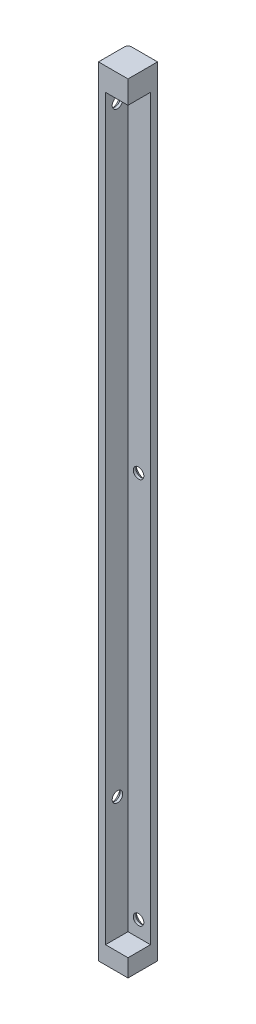
ISO-10303-21;
HEADER;
FILE_DESCRIPTION(('STEP AP214'),'2;1');
FILE_NAME('part.step','',(''),(''),'','','');
FILE_SCHEMA(('AUTOMOTIVE_DESIGN { 1 0 10303 214 1 1 1 1 }'));
ENDSEC;
DATA;
#1=APPLICATION_CONTEXT('core data for automotive mechanical design processes');
#2=APPLICATION_PROTOCOL_DEFINITION('international standard','automotive_design',2000,#1);
#3=PRODUCT_CONTEXT('',#1,'mechanical');
#4=PRODUCT('Part','Part','',(#3));
#5=PRODUCT_RELATED_PRODUCT_CATEGORY('part','',(#4));
#6=PRODUCT_DEFINITION_FORMATION('','',#4);
#7=PRODUCT_DEFINITION_CONTEXT('part definition',#1,'design');
#8=PRODUCT_DEFINITION('design','',#6,#7);
#9=PRODUCT_DEFINITION_SHAPE('','',#8);
#10=(LENGTH_UNIT() NAMED_UNIT(*) SI_UNIT(.MILLI.,.METRE.));
#11=(NAMED_UNIT(*) PLANE_ANGLE_UNIT() SI_UNIT($,.RADIAN.));
#12=(NAMED_UNIT(*) SI_UNIT($,.STERADIAN.) SOLID_ANGLE_UNIT());
#13=UNCERTAINTY_MEASURE_WITH_UNIT(LENGTH_MEASURE(1.E-05),#10,'distance_accuracy_value','');
#14=(GEOMETRIC_REPRESENTATION_CONTEXT(3) GLOBAL_UNCERTAINTY_ASSIGNED_CONTEXT((#13)) GLOBAL_UNIT_ASSIGNED_CONTEXT((#10,
#11,#12)) REPRESENTATION_CONTEXT('',''));
#15=CARTESIAN_POINT('',(0.,0.,0.));
#16=DIRECTION('',(0.,0.,1.));
#17=DIRECTION('',(1.,0.,0.));
#18=AXIS2_PLACEMENT_3D('',#15,#16,#17);
#19=CARTESIAN_POINT('',(2.,221.5,0.));
#20=DIRECTION('',(-1.,0.,0.));
#21=DIRECTION('',(0.,0.,1.));
#22=AXIS2_PLACEMENT_3D('',#19,#20,#21);
#23=PLANE('',#22);
#24=CARTESIAN_POINT('',(2.,211.249999999999,-4.));
#25=DIRECTION('',(-1.,0.,0.));
#26=DIRECTION('',(0.,0.,1.));
#27=AXIS2_PLACEMENT_3D('',#24,#25,#26);
#28=CIRCLE('',#27,1.5);
#29=CARTESIAN_POINT('',(2.,211.249999999999,-2.5));
#30=VERTEX_POINT('',#29);
#31=EDGE_CURVE('E188',#30,#30,#28,.T.);
#32=ORIENTED_EDGE('',*,*,#31,.T.);
#33=EDGE_LOOP('',(#32));
#34=FACE_BOUND('',#33,.T.);
#35=CARTESIAN_POINT('',(2.,40.25,-4.));
#36=DIRECTION('',(-1.,0.,0.));
#37=DIRECTION('',(0.,0.,1.));
#38=AXIS2_PLACEMENT_3D('',#35,#36,#37);
#39=CIRCLE('',#38,1.5);
#40=CARTESIAN_POINT('',(2.,40.25,-2.5));
#41=VERTEX_POINT('',#40);
#42=EDGE_CURVE('E195',#41,#41,#39,.T.);
#43=ORIENTED_EDGE('',*,*,#42,.T.);
#44=EDGE_LOOP('',(#43));
#45=FACE_BOUND('',#44,.T.);
#46=DIRECTION('',(0.,0.,1.));
#47=VECTOR('',#46,1.);
#48=CARTESIAN_POINT('',(2.,215.5,0.));
#49=LINE('',#48,#47);
#50=CARTESIAN_POINT('',(2.,215.5,-7.));
#51=VERTEX_POINT('',#50);
#52=CARTESIAN_POINT('',(2.,215.5,-0.599999999999999));
#53=VERTEX_POINT('',#52);
#54=EDGE_CURVE('E160',#51,#53,#49,.T.);
#55=ORIENTED_EDGE('',*,*,#54,.T.);
#56=DIRECTION('',(0.,-1.,0.));
#57=VECTOR('',#56,1.);
#58=CARTESIAN_POINT('',(2.,221.5,-0.6));
#59=LINE('',#58,#57);
#60=CARTESIAN_POINT('',(2.,5.5,-0.599999999999973));
#61=VERTEX_POINT('',#60);
#62=EDGE_CURVE('E144',#53,#61,#59,.T.);
#63=ORIENTED_EDGE('',*,*,#62,.T.);
#64=DIRECTION('',(0.,0.,-1.));
#65=VECTOR('',#64,1.);
#66=CARTESIAN_POINT('',(2.,5.50000000000001,0.));
#67=LINE('',#66,#65);
#68=CARTESIAN_POINT('',(2.,5.50000000000001,-7.));
#69=VERTEX_POINT('',#68);
#70=EDGE_CURVE('E166',#61,#69,#67,.T.);
#71=ORIENTED_EDGE('',*,*,#70,.T.);
#72=DIRECTION('',(0.,-1.,0.));
#73=VECTOR('',#72,1.);
#74=CARTESIAN_POINT('',(2.,221.5,-7.));
#75=LINE('',#74,#73);
#76=EDGE_CURVE('E196',#51,#69,#75,.T.);
#77=ORIENTED_EDGE('',*,*,#76,.F.);
#78=EDGE_LOOP('',(#55,#63,#71,#77));
#79=FACE_BOUND('',#78,.T.);
#80=ADVANCED_FACE('F37',(#34,#45,#79),#23,.F.);
#81=CARTESIAN_POINT('',(2.,221.5,-7.));
#82=DIRECTION('',(0.,0.,-1.));
#83=DIRECTION('',(-1.,0.,0.));
#84=AXIS2_PLACEMENT_3D('',#81,#82,#83);
#85=PLANE('',#84);
#86=CARTESIAN_POINT('',(5.,120.,-7.));
#87=DIRECTION('',(0.,0.,-1.));
#88=DIRECTION('',(-1.,0.,0.));
#89=AXIS2_PLACEMENT_3D('',#86,#87,#88);
#90=CIRCLE('',#89,1.5);
#91=CARTESIAN_POINT('',(3.5,120.,-7.));
#92=VERTEX_POINT('',#91);
#93=EDGE_CURVE('E174',#92,#92,#90,.T.);
#94=ORIENTED_EDGE('',*,*,#93,.T.);
#95=EDGE_LOOP('',(#94));
#96=FACE_BOUND('',#95,.T.);
#97=CARTESIAN_POINT('',(4.99999999999525,10.,-7.));
#98=DIRECTION('',(0.,0.,-1.));
#99=DIRECTION('',(-1.,0.,0.));
#100=AXIS2_PLACEMENT_3D('',#97,#98,#99);
#101=CIRCLE('',#100,1.5);
#102=CARTESIAN_POINT('',(3.49999999999525,10.,-7.));
#103=VERTEX_POINT('',#102);
#104=EDGE_CURVE('E181',#103,#103,#101,.T.);
#105=ORIENTED_EDGE('',*,*,#104,.T.);
#106=EDGE_LOOP('',(#105));
#107=FACE_BOUND('',#106,.T.);
#108=DIRECTION('',(1.,0.,0.));
#109=VECTOR('',#108,1.);
#110=CARTESIAN_POINT('',(1.,5.5,-7.));
#111=LINE('',#110,#109);
#112=CARTESIAN_POINT('',(8.4,5.50000000000001,-7.));
#113=VERTEX_POINT('',#112);
#114=EDGE_CURVE('E163',#69,#113,#111,.T.);
#115=ORIENTED_EDGE('',*,*,#114,.T.);
#116=DIRECTION('',(0.,1.,0.));
#117=VECTOR('',#116,1.);
#118=CARTESIAN_POINT('',(8.4,221.5,-7.));
#119=LINE('',#118,#117);
#120=CARTESIAN_POINT('',(8.4,215.5,-7.));
#121=VERTEX_POINT('',#120);
#122=EDGE_CURVE('E153',#113,#121,#119,.T.);
#123=ORIENTED_EDGE('',*,*,#122,.T.);
#124=DIRECTION('',(-1.,0.,0.));
#125=VECTOR('',#124,1.);
#126=CARTESIAN_POINT('',(2.,215.5,-7.));
#127=LINE('',#126,#125);
#128=EDGE_CURVE('E158',#121,#51,#127,.T.);
#129=ORIENTED_EDGE('',*,*,#128,.T.);
#130=ORIENTED_EDGE('',*,*,#76,.T.);
#131=EDGE_LOOP('',(#115,#123,#129,#130));
#132=FACE_BOUND('',#131,.T.);
#133=ADVANCED_FACE('F226',(#96,#107,#132),#85,.F.);
#134=CARTESIAN_POINT('',(0.,221.5,-9.));
#135=DIRECTION('',(0.,0.,1.));
#136=DIRECTION('',(1.,0.,0.));
#137=AXIS2_PLACEMENT_3D('',#134,#135,#136);
#138=PLANE('',#137);
#139=CARTESIAN_POINT('',(5.,120.,-9.));
#140=DIRECTION('',(0.,0.,-1.));
#141=DIRECTION('',(-1.,0.,0.));
#142=AXIS2_PLACEMENT_3D('',#139,#140,#141);
#143=CIRCLE('',#142,2.75);
#144=CARTESIAN_POINT('',(2.25,120.,-9.));
#145=VERTEX_POINT('',#144);
#146=EDGE_CURVE('E168',#145,#145,#143,.T.);
#147=ORIENTED_EDGE('',*,*,#146,.F.);
#148=EDGE_LOOP('',(#147));
#149=FACE_BOUND('',#148,.T.);
#150=CARTESIAN_POINT('',(4.99999999999525,10.,-9.));
#151=DIRECTION('',(0.,0.,-1.));
#152=DIRECTION('',(-1.,0.,0.));
#153=AXIS2_PLACEMENT_3D('',#150,#151,#152);
#154=CIRCLE('',#153,2.75);
#155=CARTESIAN_POINT('',(2.24999999999525,10.,-9.));
#156=VERTEX_POINT('',#155);
#157=EDGE_CURVE('E175',#156,#156,#154,.T.);
#158=ORIENTED_EDGE('',*,*,#157,.F.);
#159=EDGE_LOOP('',(#158));
#160=FACE_BOUND('',#159,.T.);
#161=DIRECTION('',(1.,0.,0.));
#162=VECTOR('',#161,1.);
#163=CARTESIAN_POINT('',(1.,0.5,-9.));
#164=LINE('',#163,#162);
#165=CARTESIAN_POINT('',(1.,0.5,-9.));
#166=VERTEX_POINT('',#165);
#167=CARTESIAN_POINT('',(8.4,0.5,-9.));
#168=VERTEX_POINT('',#167);
#169=EDGE_CURVE('E108',#166,#168,#164,.T.);
#170=ORIENTED_EDGE('',*,*,#169,.F.);
#171=DIRECTION('',(0.,1.,0.));
#172=VECTOR('',#171,1.);
#173=CARTESIAN_POINT('',(1.,221.5,-9.));
#174=LINE('',#173,#172);
#175=CARTESIAN_POINT('',(1.,222.,-9.));
#176=VERTEX_POINT('',#175);
#177=EDGE_CURVE('E212',#166,#176,#174,.T.);
#178=ORIENTED_EDGE('',*,*,#177,.T.);
#179=DIRECTION('',(1.,0.,0.));
#180=VECTOR('',#179,1.);
#181=CARTESIAN_POINT('',(0.,222.,-9.));
#182=LINE('',#181,#180);
#183=CARTESIAN_POINT('',(8.4,222.,-9.));
#184=VERTEX_POINT('',#183);
#185=EDGE_CURVE('E123',#176,#184,#182,.T.);
#186=ORIENTED_EDGE('',*,*,#185,.T.);
#187=DIRECTION('',(0.,1.,0.));
#188=VECTOR('',#187,1.);
#189=CARTESIAN_POINT('',(8.4,-3.,-9.));
#190=LINE('',#189,#188);
#191=EDGE_CURVE('E121',#168,#184,#190,.T.);
#192=ORIENTED_EDGE('',*,*,#191,.F.);
#193=EDGE_LOOP('',(#170,#178,#186,#192));
#194=FACE_BOUND('',#193,.T.);
#195=ADVANCED_FACE('F122',(#149,#160,#194),#138,.F.);
#196=CARTESIAN_POINT('',(0.,221.5,0.));
#197=DIRECTION('',(1.,0.,0.));
#198=DIRECTION('',(0.,0.,-1.));
#199=AXIS2_PLACEMENT_3D('',#196,#197,#198);
#200=PLANE('',#199);
#201=CARTESIAN_POINT('',(0.,211.249999999999,-4.));
#202=DIRECTION('',(-1.,0.,0.));
#203=DIRECTION('',(0.,0.,1.));
#204=AXIS2_PLACEMENT_3D('',#201,#202,#203);
#205=CIRCLE('',#204,2.75);
#206=CARTESIAN_POINT('',(0.,211.249999999999,-1.25));
#207=VERTEX_POINT('',#206);
#208=EDGE_CURVE('E182',#207,#207,#205,.T.);
#209=ORIENTED_EDGE('',*,*,#208,.F.);
#210=EDGE_LOOP('',(#209));
#211=FACE_BOUND('',#210,.T.);
#212=CARTESIAN_POINT('',(0.,40.25,-4.));
#213=DIRECTION('',(-1.,0.,0.));
#214=DIRECTION('',(0.,0.,1.));
#215=AXIS2_PLACEMENT_3D('',#212,#213,#214);
#216=CIRCLE('',#215,2.75);
#217=CARTESIAN_POINT('',(0.,40.25,-1.25));
#218=VERTEX_POINT('',#217);
#219=EDGE_CURVE('E189',#218,#218,#216,.T.);
#220=ORIENTED_EDGE('',*,*,#219,.F.);
#221=EDGE_LOOP('',(#220));
#222=FACE_BOUND('',#221,.T.);
#223=DIRECTION('',(0.,0.,-1.));
#224=VECTOR('',#223,1.);
#225=CARTESIAN_POINT('',(0.,222.,0.));
#226=LINE('',#225,#224);
#227=CARTESIAN_POINT('',(0.,222.,-0.6));
#228=VERTEX_POINT('',#227);
#229=CARTESIAN_POINT('',(0.,222.,-8.));
#230=VERTEX_POINT('',#229);
#231=EDGE_CURVE('E149',#228,#230,#226,.T.);
#232=ORIENTED_EDGE('',*,*,#231,.T.);
#233=DIRECTION('',(0.,1.,0.));
#234=VECTOR('',#233,1.);
#235=CARTESIAN_POINT('',(0.,221.5,-8.));
#236=LINE('',#235,#234);
#237=CARTESIAN_POINT('',(0.,0.5,-8.));
#238=VERTEX_POINT('',#237);
#239=EDGE_CURVE('E45',#230,#238,#236,.F.);
#240=ORIENTED_EDGE('',*,*,#239,.T.);
#241=DIRECTION('',(0.,0.,-1.));
#242=VECTOR('',#241,1.);
#243=CARTESIAN_POINT('',(0.,0.5,-0.599999999999973));
#244=LINE('',#243,#242);
#245=CARTESIAN_POINT('',(0.,0.5,-0.599999999999973));
#246=VERTEX_POINT('',#245);
#247=EDGE_CURVE('E134',#246,#238,#244,.T.);
#248=ORIENTED_EDGE('',*,*,#247,.F.);
#249=DIRECTION('',(0.,-1.,0.));
#250=VECTOR('',#249,1.);
#251=CARTESIAN_POINT('',(0.,222.,-0.6));
#252=LINE('',#251,#250);
#253=EDGE_CURVE('E138',#228,#246,#252,.T.);
#254=ORIENTED_EDGE('',*,*,#253,.F.);
#255=EDGE_LOOP('',(#232,#240,#248,#254));
#256=FACE_BOUND('',#255,.T.);
#257=ADVANCED_FACE('F236',(#211,#222,#256),#200,.F.);
#258=CARTESIAN_POINT('',(0.,40.25,-4.));
#259=DIRECTION('',(-1.,0.,0.));
#260=DIRECTION('',(0.,0.,1.));
#261=AXIS2_PLACEMENT_3D('',#258,#259,#260);
#262=CYLINDRICAL_SURFACE('',#261,1.5);
#263=CARTESIAN_POINT('',(1.25,40.25,-4.));
#264=DIRECTION('',(-1.,0.,0.));
#265=DIRECTION('',(0.,0.,1.));
#266=AXIS2_PLACEMENT_3D('',#263,#264,#265);
#267=CIRCLE('',#266,1.5);
#268=CARTESIAN_POINT('',(1.25,40.25,-2.5));
#269=VERTEX_POINT('',#268);
#270=EDGE_CURVE('E192',#269,#269,#267,.T.);
#271=ORIENTED_EDGE('',*,*,#270,.T.);
#272=EDGE_LOOP('',(#271));
#273=FACE_BOUND('',#272,.T.);
#274=ORIENTED_EDGE('',*,*,#42,.F.);
#275=EDGE_LOOP('',(#274));
#276=FACE_BOUND('',#275,.T.);
#277=ADVANCED_FACE('F256',(#273,#276),#262,.F.);
#278=CARTESIAN_POINT('',(0.,40.25,-4.));
#279=DIRECTION('',(-1.,0.,0.));
#280=DIRECTION('',(0.,0.,1.));
#281=AXIS2_PLACEMENT_3D('',#278,#279,#280);
#282=CONICAL_SURFACE('',#281,2.75,0.785398163397449);
#283=ORIENTED_EDGE('',*,*,#270,.F.);
#284=EDGE_LOOP('',(#283));
#285=FACE_BOUND('',#284,.T.);
#286=ORIENTED_EDGE('',*,*,#219,.T.);
#287=EDGE_LOOP('',(#286));
#288=FACE_BOUND('',#287,.T.);
#289=ADVANCED_FACE('F260',(#285,#288),#282,.F.);
#290=CARTESIAN_POINT('',(0.,211.249999999999,-4.));
#291=DIRECTION('',(-1.,0.,0.));
#292=DIRECTION('',(0.,0.,1.));
#293=AXIS2_PLACEMENT_3D('',#290,#291,#292);
#294=CYLINDRICAL_SURFACE('',#293,1.5);
#295=CARTESIAN_POINT('',(1.25,211.249999999999,-4.));
#296=DIRECTION('',(-1.,0.,0.));
#297=DIRECTION('',(0.,0.,1.));
#298=AXIS2_PLACEMENT_3D('',#295,#296,#297);
#299=CIRCLE('',#298,1.5);
#300=CARTESIAN_POINT('',(1.25,211.249999999999,-2.5));
#301=VERTEX_POINT('',#300);
#302=EDGE_CURVE('E185',#301,#301,#299,.T.);
#303=ORIENTED_EDGE('',*,*,#302,.T.);
#304=EDGE_LOOP('',(#303));
#305=FACE_BOUND('',#304,.T.);
#306=ORIENTED_EDGE('',*,*,#31,.F.);
#307=EDGE_LOOP('',(#306));
#308=FACE_BOUND('',#307,.T.);
#309=ADVANCED_FACE('F264',(#305,#308),#294,.F.);
#310=CARTESIAN_POINT('',(0.,211.249999999999,-4.));
#311=DIRECTION('',(-1.,0.,0.));
#312=DIRECTION('',(0.,0.,1.));
#313=AXIS2_PLACEMENT_3D('',#310,#311,#312);
#314=CONICAL_SURFACE('',#313,2.75,0.785398163397449);
#315=ORIENTED_EDGE('',*,*,#302,.F.);
#316=EDGE_LOOP('',(#315));
#317=FACE_BOUND('',#316,.T.);
#318=ORIENTED_EDGE('',*,*,#208,.T.);
#319=EDGE_LOOP('',(#318));
#320=FACE_BOUND('',#319,.T.);
#321=ADVANCED_FACE('F268',(#317,#320),#314,.F.);
#322=CARTESIAN_POINT('',(4.99999999999525,10.,-9.));
#323=DIRECTION('',(0.,0.,-1.));
#324=DIRECTION('',(-1.,0.,0.));
#325=AXIS2_PLACEMENT_3D('',#322,#323,#324);
#326=CYLINDRICAL_SURFACE('',#325,1.5);
#327=CARTESIAN_POINT('',(4.99999999999525,10.,-7.75));
#328=DIRECTION('',(0.,0.,-1.));
#329=DIRECTION('',(-1.,0.,0.));
#330=AXIS2_PLACEMENT_3D('',#327,#328,#329);
#331=CIRCLE('',#330,1.5);
#332=CARTESIAN_POINT('',(3.49999999999525,10.,-7.75));
#333=VERTEX_POINT('',#332);
#334=EDGE_CURVE('E178',#333,#333,#331,.T.);
#335=ORIENTED_EDGE('',*,*,#334,.T.);
#336=EDGE_LOOP('',(#335));
#337=FACE_BOUND('',#336,.T.);
#338=ORIENTED_EDGE('',*,*,#104,.F.);
#339=EDGE_LOOP('',(#338));
#340=FACE_BOUND('',#339,.T.);
#341=ADVANCED_FACE('F272',(#337,#340),#326,.F.);
#342=CARTESIAN_POINT('',(4.99999999999525,10.,-9.));
#343=DIRECTION('',(0.,0.,-1.));
#344=DIRECTION('',(-1.,0.,0.));
#345=AXIS2_PLACEMENT_3D('',#342,#343,#344);
#346=CONICAL_SURFACE('',#345,2.75,0.785398163397449);
#347=ORIENTED_EDGE('',*,*,#334,.F.);
#348=EDGE_LOOP('',(#347));
#349=FACE_BOUND('',#348,.T.);
#350=ORIENTED_EDGE('',*,*,#157,.T.);
#351=EDGE_LOOP('',(#350));
#352=FACE_BOUND('',#351,.T.);
#353=ADVANCED_FACE('F276',(#349,#352),#346,.F.);
#354=CARTESIAN_POINT('',(5.,120.,-9.));
#355=DIRECTION('',(0.,0.,-1.));
#356=DIRECTION('',(-1.,0.,0.));
#357=AXIS2_PLACEMENT_3D('',#354,#355,#356);
#358=CYLINDRICAL_SURFACE('',#357,1.5);
#359=CARTESIAN_POINT('',(5.,120.,-7.75));
#360=DIRECTION('',(0.,0.,-1.));
#361=DIRECTION('',(-1.,0.,0.));
#362=AXIS2_PLACEMENT_3D('',#359,#360,#361);
#363=CIRCLE('',#362,1.5);
#364=CARTESIAN_POINT('',(3.5,120.,-7.75));
#365=VERTEX_POINT('',#364);
#366=EDGE_CURVE('E171',#365,#365,#363,.T.);
#367=ORIENTED_EDGE('',*,*,#366,.T.);
#368=EDGE_LOOP('',(#367));
#369=FACE_BOUND('',#368,.T.);
#370=ORIENTED_EDGE('',*,*,#93,.F.);
#371=EDGE_LOOP('',(#370));
#372=FACE_BOUND('',#371,.T.);
#373=ADVANCED_FACE('F280',(#369,#372),#358,.F.);
#374=CARTESIAN_POINT('',(5.,120.,-9.));
#375=DIRECTION('',(0.,0.,-1.));
#376=DIRECTION('',(-1.,0.,0.));
#377=AXIS2_PLACEMENT_3D('',#374,#375,#376);
#378=CONICAL_SURFACE('',#377,2.75,0.785398163397449);
#379=ORIENTED_EDGE('',*,*,#366,.F.);
#380=EDGE_LOOP('',(#379));
#381=FACE_BOUND('',#380,.T.);
#382=ORIENTED_EDGE('',*,*,#146,.T.);
#383=EDGE_LOOP('',(#382));
#384=FACE_BOUND('',#383,.T.);
#385=ADVANCED_FACE('F284',(#381,#384),#378,.F.);
#386=CARTESIAN_POINT('',(0.,5.5,0.));
#387=DIRECTION('',(0.,1.,0.));
#388=DIRECTION('',(0.,0.,1.));
#389=AXIS2_PLACEMENT_3D('',#386,#387,#388);
#390=PLANE('',#389);
#391=DIRECTION('',(-1.,0.,0.));
#392=VECTOR('',#391,1.);
#393=CARTESIAN_POINT('',(0.,5.5,-0.599999999999973));
#394=LINE('',#393,#392);
#395=CARTESIAN_POINT('',(8.4,5.5,-0.599999999999973));
#396=VERTEX_POINT('',#395);
#397=EDGE_CURVE('E141',#396,#61,#394,.T.);
#398=ORIENTED_EDGE('',*,*,#397,.F.);
#399=DIRECTION('',(0.,0.,1.));
#400=VECTOR('',#399,1.);
#401=CARTESIAN_POINT('',(8.4,5.5,0.));
#402=LINE('',#401,#400);
#403=EDGE_CURVE('E156',#113,#396,#402,.T.);
#404=ORIENTED_EDGE('',*,*,#403,.F.);
#405=ORIENTED_EDGE('',*,*,#114,.F.);
#406=ORIENTED_EDGE('',*,*,#70,.F.);
#407=EDGE_LOOP('',(#398,#404,#405,#406));
#408=FACE_BOUND('',#407,.T.);
#409=ADVANCED_FACE('F232',(#408),#390,.T.);
#410=CARTESIAN_POINT('',(0.,215.5,0.));
#411=DIRECTION('',(0.,-1.,0.));
#412=DIRECTION('',(0.,0.,-1.));
#413=AXIS2_PLACEMENT_3D('',#410,#411,#412);
#414=PLANE('',#413);
#415=DIRECTION('',(1.,0.,0.));
#416=VECTOR('',#415,1.);
#417=CARTESIAN_POINT('',(0.,215.5,-0.599999999999999));
#418=LINE('',#417,#416);
#419=CARTESIAN_POINT('',(8.4,215.5,-0.599999999999999));
#420=VERTEX_POINT('',#419);
#421=EDGE_CURVE('E147',#53,#420,#418,.T.);
#422=ORIENTED_EDGE('',*,*,#421,.F.);
#423=ORIENTED_EDGE('',*,*,#54,.F.);
#424=ORIENTED_EDGE('',*,*,#128,.F.);
#425=DIRECTION('',(0.,0.,-1.));
#426=VECTOR('',#425,1.);
#427=CARTESIAN_POINT('',(8.4,215.5,0.));
#428=LINE('',#427,#426);
#429=EDGE_CURVE('E127',#420,#121,#428,.T.);
#430=ORIENTED_EDGE('',*,*,#429,.F.);
#431=EDGE_LOOP('',(#422,#423,#424,#430));
#432=FACE_BOUND('',#431,.T.);
#433=ADVANCED_FACE('F222',(#432),#414,.T.);
#434=CARTESIAN_POINT('',(8.4,-3.,1.));
#435=DIRECTION('',(-1.,0.,0.));
#436=DIRECTION('',(0.,0.,1.));
#437=AXIS2_PLACEMENT_3D('',#434,#435,#436);
#438=PLANE('',#437);
#439=DIRECTION('',(0.,-1.,0.));
#440=VECTOR('',#439,1.);
#441=CARTESIAN_POINT('',(8.4,-3.,-0.599999999999972));
#442=LINE('',#441,#440);
#443=CARTESIAN_POINT('',(8.4,0.5,-0.599999999999973));
#444=VERTEX_POINT('',#443);
#445=EDGE_CURVE('E131',#396,#444,#442,.T.);
#446=ORIENTED_EDGE('',*,*,#445,.T.);
#447=DIRECTION('',(0.,0.,1.));
#448=VECTOR('',#447,1.);
#449=CARTESIAN_POINT('',(8.4,0.5,-9.));
#450=LINE('',#449,#448);
#451=EDGE_CURVE('E113',#168,#444,#450,.T.);
#452=ORIENTED_EDGE('',*,*,#451,.F.);
#453=ORIENTED_EDGE('',*,*,#191,.T.);
#454=DIRECTION('',(0.,0.,1.));
#455=VECTOR('',#454,1.);
#456=CARTESIAN_POINT('',(8.4,222.,1.));
#457=LINE('',#456,#455);
#458=CARTESIAN_POINT('',(8.4,222.,-0.6));
#459=VERTEX_POINT('',#458);
#460=EDGE_CURVE('E199',#184,#459,#457,.T.);
#461=ORIENTED_EDGE('',*,*,#460,.T.);
#462=EDGE_CURVE('E142',#459,#420,#442,.T.);
#463=ORIENTED_EDGE('',*,*,#462,.T.);
#464=ORIENTED_EDGE('',*,*,#429,.T.);
#465=ORIENTED_EDGE('',*,*,#122,.F.);
#466=ORIENTED_EDGE('',*,*,#403,.T.);
#467=EDGE_LOOP('',(#446,#452,#453,#461,#463,#464,#465,#466));
#468=FACE_BOUND('',#467,.T.);
#469=ADVANCED_FACE('F129',(#468),#438,.F.);
#470=CARTESIAN_POINT('',(8.4,222.,-10.));
#471=DIRECTION('',(0.,-1.,0.));
#472=DIRECTION('',(0.,0.,-1.));
#473=AXIS2_PLACEMENT_3D('',#470,#471,#472);
#474=PLANE('',#473);
#475=ORIENTED_EDGE('',*,*,#185,.F.);
#476=CARTESIAN_POINT('',(1.,222.,-8.));
#477=DIRECTION('',(0.,-1.,0.));
#478=DIRECTION('',(0.,0.,-1.));
#479=AXIS2_PLACEMENT_3D('',#476,#477,#478);
#480=CIRCLE('',#479,1.);
#481=EDGE_CURVE('E59',#176,#230,#480,.F.);
#482=ORIENTED_EDGE('',*,*,#481,.T.);
#483=ORIENTED_EDGE('',*,*,#231,.F.);
#484=DIRECTION('',(1.,0.,0.));
#485=VECTOR('',#484,1.);
#486=CARTESIAN_POINT('',(8.4,222.,-0.6));
#487=LINE('',#486,#485);
#488=EDGE_CURVE('E209',#228,#459,#487,.T.);
#489=ORIENTED_EDGE('',*,*,#488,.T.);
#490=ORIENTED_EDGE('',*,*,#460,.F.);
#491=EDGE_LOOP('',(#475,#482,#483,#489,#490));
#492=FACE_BOUND('',#491,.T.);
#493=ADVANCED_FACE('F215',(#492),#474,.F.);
#494=CARTESIAN_POINT('',(10.,222.,-0.6));
#495=DIRECTION('',(0.,0.,-1.));
#496=DIRECTION('',(0.,1.,0.));
#497=AXIS2_PLACEMENT_3D('',#494,#495,#496);
#498=PLANE('',#497);
#499=ORIENTED_EDGE('',*,*,#253,.T.);
#500=DIRECTION('',(-1.,0.,0.));
#501=VECTOR('',#500,1.);
#502=CARTESIAN_POINT('',(8.4,0.5,-0.599999999999973));
#503=LINE('',#502,#501);
#504=EDGE_CURVE('E132',#444,#246,#503,.T.);
#505=ORIENTED_EDGE('',*,*,#504,.F.);
#506=ORIENTED_EDGE('',*,*,#445,.F.);
#507=ORIENTED_EDGE('',*,*,#397,.T.);
#508=ORIENTED_EDGE('',*,*,#62,.F.);
#509=ORIENTED_EDGE('',*,*,#421,.T.);
#510=ORIENTED_EDGE('',*,*,#462,.F.);
#511=ORIENTED_EDGE('',*,*,#488,.F.);
#512=EDGE_LOOP('',(#499,#505,#506,#507,#508,#509,#510,#511));
#513=FACE_BOUND('',#512,.T.);
#514=ADVANCED_FACE('F234',(#513),#498,.F.);
#515=CARTESIAN_POINT('',(0.,0.5,0.));
#516=DIRECTION('',(0.,-1.,0.));
#517=DIRECTION('',(0.,0.,-1.));
#518=AXIS2_PLACEMENT_3D('',#515,#516,#517);
#519=PLANE('',#518);
#520=ORIENTED_EDGE('',*,*,#247,.T.);
#521=CARTESIAN_POINT('',(1.,0.5,-8.));
#522=DIRECTION('',(0.,-1.,0.));
#523=DIRECTION('',(0.,0.,-1.));
#524=AXIS2_PLACEMENT_3D('',#521,#522,#523);
#525=CIRCLE('',#524,1.);
#526=EDGE_CURVE('E11',#238,#166,#525,.T.);
#527=ORIENTED_EDGE('',*,*,#526,.T.);
#528=ORIENTED_EDGE('',*,*,#169,.T.);
#529=ORIENTED_EDGE('',*,*,#451,.T.);
#530=ORIENTED_EDGE('',*,*,#504,.T.);
#531=EDGE_LOOP('',(#520,#527,#528,#529,#530));
#532=FACE_BOUND('',#531,.T.);
#533=ADVANCED_FACE('F110',(#532),#519,.T.);
#534=CARTESIAN_POINT('',(1.,221.5,-8.));
#535=DIRECTION('',(0.,1.,0.));
#536=DIRECTION('',(0.,0.,1.));
#537=AXIS2_PLACEMENT_3D('',#534,#535,#536);
#538=CYLINDRICAL_SURFACE('',#537,1.);
#539=ORIENTED_EDGE('',*,*,#526,.F.);
#540=ORIENTED_EDGE('',*,*,#239,.F.);
#541=ORIENTED_EDGE('',*,*,#481,.F.);
#542=ORIENTED_EDGE('',*,*,#177,.F.);
#543=EDGE_LOOP('',(#539,#540,#541,#542));
#544=FACE_BOUND('',#543,.T.);
#545=ADVANCED_FACE('F39',(#544),#538,.T.);
#546=CLOSED_SHELL('',(#80,#133,#195,#257,#277,#289,#309,#321,#341,#353,#373,#385,#409,#433,#469,
#493,#514,#533,#545));
#547=MANIFOLD_SOLID_BREP('B2',#546);
#548=ADVANCED_BREP_SHAPE_REPRESENTATION('',(#18,#547),#14);
#549=SHAPE_DEFINITION_REPRESENTATION(#9,#548);
ENDSEC;
END-ISO-10303-21;
